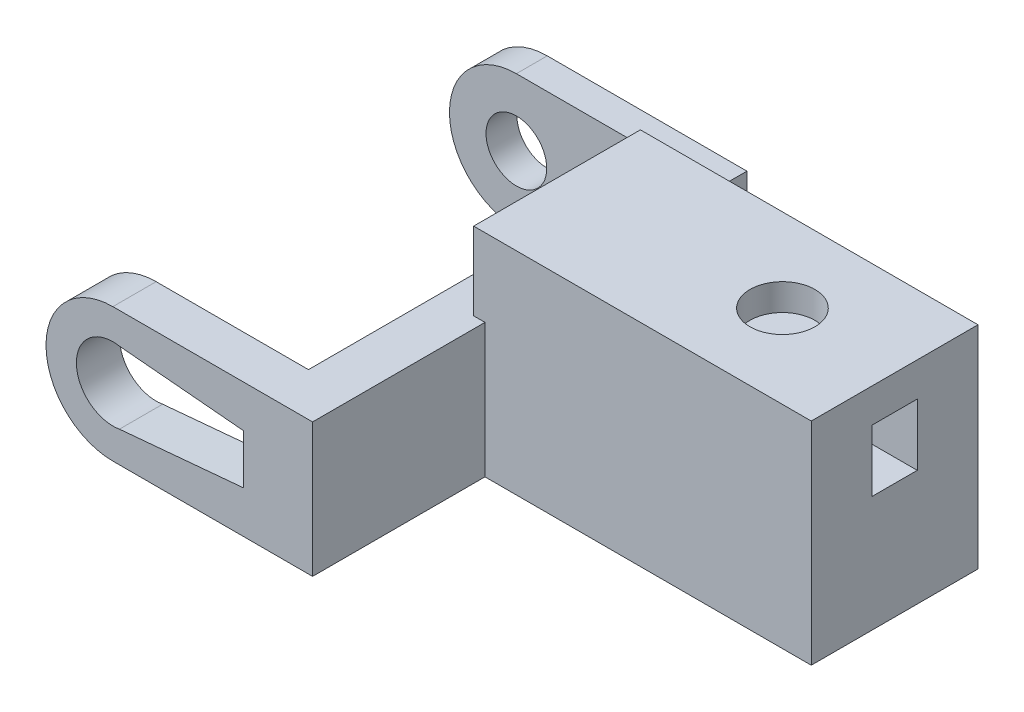
ISO-10303-21;
HEADER;
FILE_DESCRIPTION(('STEP AP214'),'2;1');
FILE_NAME('part.step','',(''),(''),'','','');
FILE_SCHEMA(('AUTOMOTIVE_DESIGN { 1 0 10303 214 1 1 1 1 }'));
ENDSEC;
DATA;
#1=APPLICATION_CONTEXT('core data for automotive mechanical design processes');
#2=APPLICATION_PROTOCOL_DEFINITION('international standard','automotive_design',2000,#1);
#3=PRODUCT_CONTEXT('',#1,'mechanical');
#4=PRODUCT('Part','Part','',(#3));
#5=PRODUCT_RELATED_PRODUCT_CATEGORY('part','',(#4));
#6=PRODUCT_DEFINITION_FORMATION('','',#4);
#7=PRODUCT_DEFINITION_CONTEXT('part definition',#1,'design');
#8=PRODUCT_DEFINITION('design','',#6,#7);
#9=PRODUCT_DEFINITION_SHAPE('','',#8);
#10=(LENGTH_UNIT() NAMED_UNIT(*) SI_UNIT(.MILLI.,.METRE.));
#11=(NAMED_UNIT(*) PLANE_ANGLE_UNIT() SI_UNIT($,.RADIAN.));
#12=(NAMED_UNIT(*) SI_UNIT($,.STERADIAN.) SOLID_ANGLE_UNIT());
#13=UNCERTAINTY_MEASURE_WITH_UNIT(LENGTH_MEASURE(1.E-05),#10,'distance_accuracy_value','');
#14=(GEOMETRIC_REPRESENTATION_CONTEXT(3) GLOBAL_UNCERTAINTY_ASSIGNED_CONTEXT((#13)) GLOBAL_UNIT_ASSIGNED_CONTEXT((#10,
#11,#12)) REPRESENTATION_CONTEXT('',''));
#15=CARTESIAN_POINT('',(0.,0.,0.));
#16=DIRECTION('',(0.,0.,1.));
#17=DIRECTION('',(1.,0.,0.));
#18=AXIS2_PLACEMENT_3D('',#15,#16,#17);
#19=CARTESIAN_POINT('',(-44.6,0.,0.));
#20=DIRECTION('',(-1.,0.,0.));
#21=DIRECTION('',(0.,0.,1.));
#22=AXIS2_PLACEMENT_3D('',#19,#20,#21);
#23=PLANE('',#22);
#24=DIRECTION('',(0.,0.,1.));
#25=VECTOR('',#24,1.);
#26=CARTESIAN_POINT('',(-44.6,-58.,24.85));
#27=LINE('',#26,#25);
#28=CARTESIAN_POINT('',(-44.6,-58.,-14.35));
#29=VERTEX_POINT('',#28);
#30=CARTESIAN_POINT('',(-44.6,-58.,20.65));
#31=VERTEX_POINT('',#30);
#32=EDGE_CURVE('E417',#29,#31,#27,.T.);
#33=ORIENTED_EDGE('',*,*,#32,.F.);
#34=DIRECTION('',(0.,-1.,0.));
#35=VECTOR('',#34,1.);
#36=CARTESIAN_POINT('',(-44.6,0.,-14.35));
#37=LINE('',#36,#35);
#38=CARTESIAN_POINT('',(-44.6,-71.,-14.35));
#39=VERTEX_POINT('',#38);
#40=EDGE_CURVE('E11',#29,#39,#37,.T.);
#41=ORIENTED_EDGE('',*,*,#40,.T.);
#42=DIRECTION('',(0.,0.,-1.));
#43=VECTOR('',#42,1.);
#44=CARTESIAN_POINT('',(-44.6,-71.,24.85));
#45=LINE('',#44,#43);
#46=CARTESIAN_POINT('',(-44.6,-71.,20.65));
#47=VERTEX_POINT('',#46);
#48=EDGE_CURVE('E411',#47,#39,#45,.T.);
#49=ORIENTED_EDGE('',*,*,#48,.F.);
#50=DIRECTION('',(0.,-1.,0.));
#51=VECTOR('',#50,1.);
#52=CARTESIAN_POINT('',(-44.6,0.,20.65));
#53=LINE('',#52,#51);
#54=EDGE_CURVE('E506',#31,#47,#53,.T.);
#55=ORIENTED_EDGE('',*,*,#54,.F.);
#56=EDGE_LOOP('',(#33,#41,#49,#55));
#57=FACE_BOUND('',#56,.T.);
#58=ADVANCED_FACE('F39',(#57),#23,.T.);
#59=CARTESIAN_POINT('',(-41.1,-50.45,8.1));
#60=DIRECTION('',(1.,0.,0.));
#61=DIRECTION('',(0.,0.,-1.));
#62=AXIS2_PLACEMENT_3D('',#59,#60,#61);
#63=PLANE('',#62);
#64=DIRECTION('',(0.,0.,-1.));
#65=VECTOR('',#64,1.);
#66=CARTESIAN_POINT('',(-41.1,-58.,8.1));
#67=LINE('',#66,#65);
#68=CARTESIAN_POINT('',(-41.1,-58.,8.1));
#69=VERTEX_POINT('',#68);
#70=CARTESIAN_POINT('',(-41.1,-58.,-8.1));
#71=VERTEX_POINT('',#70);
#72=EDGE_CURVE('E456',#69,#71,#67,.T.);
#73=ORIENTED_EDGE('',*,*,#72,.F.);
#74=DIRECTION('',(0.,-1.,0.));
#75=VECTOR('',#74,1.);
#76=CARTESIAN_POINT('',(-41.1,-50.45,8.1));
#77=LINE('',#76,#75);
#78=CARTESIAN_POINT('',(-41.1,-50.45,8.1));
#79=VERTEX_POINT('',#78);
#80=EDGE_CURVE('E498',#79,#69,#77,.T.);
#81=ORIENTED_EDGE('',*,*,#80,.F.);
#82=DIRECTION('',(0.,0.,1.));
#83=VECTOR('',#82,1.);
#84=CARTESIAN_POINT('',(-41.1,-50.45,8.1));
#85=LINE('',#84,#83);
#86=CARTESIAN_POINT('',(-41.1,-50.45,-8.1));
#87=VERTEX_POINT('',#86);
#88=EDGE_CURVE('E465',#87,#79,#85,.T.);
#89=ORIENTED_EDGE('',*,*,#88,.F.);
#90=DIRECTION('',(0.,-1.,0.));
#91=VECTOR('',#90,1.);
#92=CARTESIAN_POINT('',(-41.1,-50.45,-8.1));
#93=LINE('',#92,#91);
#94=EDGE_CURVE('E479',#87,#71,#93,.T.);
#95=ORIENTED_EDGE('',*,*,#94,.T.);
#96=EDGE_LOOP('',(#73,#81,#89,#95));
#97=FACE_BOUND('',#96,.T.);
#98=ADVANCED_FACE('F41',(#97),#63,.F.);
#99=CARTESIAN_POINT('',(-41.1,-50.45,8.1));
#100=DIRECTION('',(0.,0.,-1.));
#101=DIRECTION('',(-1.,0.,0.));
#102=AXIS2_PLACEMENT_3D('',#99,#100,#101);
#103=PLANE('',#102);
#104=DIRECTION('',(-1.,0.,0.));
#105=VECTOR('',#104,1.);
#106=CARTESIAN_POINT('',(-41.1,-58.,8.1));
#107=LINE('',#106,#105);
#108=CARTESIAN_POINT('',(-40.,-58.,8.1));
#109=VERTEX_POINT('',#108);
#110=EDGE_CURVE('E460',#109,#69,#107,.T.);
#111=ORIENTED_EDGE('',*,*,#110,.F.);
#112=DIRECTION('',(0.,1.,0.));
#113=VECTOR('',#112,1.);
#114=CARTESIAN_POINT('',(-40.,-50.45,8.1));
#115=LINE('',#114,#113);
#116=CARTESIAN_POINT('',(-40.,-71.,8.1));
#117=VERTEX_POINT('',#116);
#118=EDGE_CURVE('E452',#117,#109,#115,.T.);
#119=ORIENTED_EDGE('',*,*,#118,.F.);
#120=DIRECTION('',(1.,0.,0.));
#121=VECTOR('',#120,1.);
#122=CARTESIAN_POINT('',(-41.1,-71.,8.1));
#123=LINE('',#122,#121);
#124=CARTESIAN_POINT('',(-8.3,-71.,8.1));
#125=VERTEX_POINT('',#124);
#126=EDGE_CURVE('E464',#117,#125,#123,.T.);
#127=ORIENTED_EDGE('',*,*,#126,.T.);
#128=DIRECTION('',(0.,-1.,0.));
#129=VECTOR('',#128,1.);
#130=CARTESIAN_POINT('',(-8.3,-50.45,8.1));
#131=LINE('',#130,#129);
#132=CARTESIAN_POINT('',(-8.3,-50.45,8.1));
#133=VERTEX_POINT('',#132);
#134=EDGE_CURVE('E494',#133,#125,#131,.T.);
#135=ORIENTED_EDGE('',*,*,#134,.F.);
#136=DIRECTION('',(1.,0.,0.));
#137=VECTOR('',#136,1.);
#138=CARTESIAN_POINT('',(-41.1,-50.45,8.1));
#139=LINE('',#138,#137);
#140=EDGE_CURVE('E469',#79,#133,#139,.T.);
#141=ORIENTED_EDGE('',*,*,#140,.F.);
#142=ORIENTED_EDGE('',*,*,#80,.T.);
#143=EDGE_LOOP('',(#111,#119,#127,#135,#141,#142));
#144=FACE_BOUND('',#143,.T.);
#145=ADVANCED_FACE('F555',(#144),#103,.F.);
#146=CARTESIAN_POINT('',(-41.1,-50.45,-8.1));
#147=DIRECTION('',(0.,0.,1.));
#148=DIRECTION('',(1.,0.,0.));
#149=AXIS2_PLACEMENT_3D('',#146,#147,#148);
#150=PLANE('',#149);
#151=DIRECTION('',(1.,0.,0.));
#152=VECTOR('',#151,1.);
#153=CARTESIAN_POINT('',(-41.1,-58.,-8.1));
#154=LINE('',#153,#152);
#155=CARTESIAN_POINT('',(-40.,-58.,-8.1));
#156=VERTEX_POINT('',#155);
#157=EDGE_CURVE('E502',#71,#156,#154,.T.);
#158=ORIENTED_EDGE('',*,*,#157,.F.);
#159=ORIENTED_EDGE('',*,*,#94,.F.);
#160=DIRECTION('',(-1.,0.,0.));
#161=VECTOR('',#160,1.);
#162=CARTESIAN_POINT('',(-41.1,-50.45,-8.1));
#163=LINE('',#162,#161);
#164=CARTESIAN_POINT('',(-8.3,-50.45,-8.1));
#165=VERTEX_POINT('',#164);
#166=EDGE_CURVE('E476',#165,#87,#163,.T.);
#167=ORIENTED_EDGE('',*,*,#166,.F.);
#168=DIRECTION('',(0.,-1.,0.));
#169=VECTOR('',#168,1.);
#170=CARTESIAN_POINT('',(-8.3,-50.45,-8.1));
#171=LINE('',#170,#169);
#172=CARTESIAN_POINT('',(-8.3,-71.,-8.1));
#173=VERTEX_POINT('',#172);
#174=EDGE_CURVE('E490',#165,#173,#171,.T.);
#175=ORIENTED_EDGE('',*,*,#174,.T.);
#176=DIRECTION('',(-1.,0.,0.));
#177=VECTOR('',#176,1.);
#178=CARTESIAN_POINT('',(-41.1,-71.,-8.1));
#179=LINE('',#178,#177);
#180=CARTESIAN_POINT('',(-40.,-71.,-8.1));
#181=VERTEX_POINT('',#180);
#182=EDGE_CURVE('E470',#173,#181,#179,.T.);
#183=ORIENTED_EDGE('',*,*,#182,.T.);
#184=DIRECTION('',(0.,-1.,0.));
#185=VECTOR('',#184,1.);
#186=CARTESIAN_POINT('',(-40.,-50.45,-8.1));
#187=LINE('',#186,#185);
#188=EDGE_CURVE('E448',#156,#181,#187,.T.);
#189=ORIENTED_EDGE('',*,*,#188,.F.);
#190=EDGE_LOOP('',(#158,#159,#167,#175,#183,#189));
#191=FACE_BOUND('',#190,.T.);
#192=ADVANCED_FACE('F582',(#191),#150,.F.);
#193=CARTESIAN_POINT('',(-8.3,-50.45,8.1));
#194=DIRECTION('',(-1.,0.,0.));
#195=DIRECTION('',(0.,0.,1.));
#196=AXIS2_PLACEMENT_3D('',#193,#194,#195);
#197=PLANE('',#196);
#198=DIRECTION('',(0.,0.,-1.));
#199=VECTOR('',#198,1.);
#200=CARTESIAN_POINT('',(-8.3,-59.75,2.2));
#201=LINE('',#200,#199);
#202=CARTESIAN_POINT('',(-8.3,-59.75,2.2));
#203=VERTEX_POINT('',#202);
#204=CARTESIAN_POINT('',(-8.3,-59.75,-2.2));
#205=VERTEX_POINT('',#204);
#206=EDGE_CURVE('E243',#203,#205,#201,.T.);
#207=ORIENTED_EDGE('',*,*,#206,.F.);
#208=DIRECTION('',(0.,-1.,0.));
#209=VECTOR('',#208,1.);
#210=CARTESIAN_POINT('',(-8.3,-59.75,2.2));
#211=LINE('',#210,#209);
#212=CARTESIAN_POINT('',(-8.3,-53.75,2.2));
#213=VERTEX_POINT('',#212);
#214=EDGE_CURVE('E55',#213,#203,#211,.T.);
#215=ORIENTED_EDGE('',*,*,#214,.F.);
#216=DIRECTION('',(0.,0.,1.));
#217=VECTOR('',#216,1.);
#218=CARTESIAN_POINT('',(-8.3,-53.75,2.2));
#219=LINE('',#218,#217);
#220=CARTESIAN_POINT('',(-8.3,-53.75,-2.2));
#221=VERTEX_POINT('',#220);
#222=EDGE_CURVE('E232',#221,#213,#219,.T.);
#223=ORIENTED_EDGE('',*,*,#222,.F.);
#224=DIRECTION('',(0.,1.,0.));
#225=VECTOR('',#224,1.);
#226=CARTESIAN_POINT('',(-8.3,-59.75,-2.2));
#227=LINE('',#226,#225);
#228=EDGE_CURVE('E236',#205,#221,#227,.T.);
#229=ORIENTED_EDGE('',*,*,#228,.F.);
#230=EDGE_LOOP('',(#207,#215,#223,#229));
#231=FACE_BOUND('',#230,.T.);
#232=DIRECTION('',(0.,0.,-1.));
#233=VECTOR('',#232,1.);
#234=CARTESIAN_POINT('',(-8.3,-71.,8.1));
#235=LINE('',#234,#233);
#236=EDGE_CURVE('E482',#125,#173,#235,.T.);
#237=ORIENTED_EDGE('',*,*,#236,.T.);
#238=ORIENTED_EDGE('',*,*,#174,.F.);
#239=DIRECTION('',(0.,0.,-1.));
#240=VECTOR('',#239,1.);
#241=CARTESIAN_POINT('',(-8.3,-50.45,8.1));
#242=LINE('',#241,#240);
#243=EDGE_CURVE('E473',#133,#165,#242,.T.);
#244=ORIENTED_EDGE('',*,*,#243,.F.);
#245=ORIENTED_EDGE('',*,*,#134,.T.);
#246=EDGE_LOOP('',(#237,#238,#244,#245));
#247=FACE_BOUND('',#246,.T.);
#248=ADVANCED_FACE('F577',(#231,#247),#197,.F.);
#249=CARTESIAN_POINT('',(0.,-50.45,0.));
#250=DIRECTION('',(0.,-1.,0.));
#251=DIRECTION('',(0.,0.,-1.));
#252=AXIS2_PLACEMENT_3D('',#249,#250,#251);
#253=PLANE('',#252);
#254=CARTESIAN_POINT('',(-19.2,-50.45,0.));
#255=DIRECTION('',(0.,1.,0.));
#256=DIRECTION('',(0.,0.,1.));
#257=AXIS2_PLACEMENT_3D('',#254,#255,#256);
#258=CIRCLE('',#257,3.15);
#259=CARTESIAN_POINT('',(-19.2,-50.45,3.15));
#260=VERTEX_POINT('',#259);
#261=EDGE_CURVE('E252',#260,#260,#258,.T.);
#262=ORIENTED_EDGE('',*,*,#261,.F.);
#263=EDGE_LOOP('',(#262));
#264=FACE_BOUND('',#263,.T.);
#265=ORIENTED_EDGE('',*,*,#88,.T.);
#266=ORIENTED_EDGE('',*,*,#140,.T.);
#267=ORIENTED_EDGE('',*,*,#243,.T.);
#268=ORIENTED_EDGE('',*,*,#166,.T.);
#269=EDGE_LOOP('',(#265,#266,#267,#268));
#270=FACE_BOUND('',#269,.T.);
#271=ADVANCED_FACE('F574',(#264,#270),#253,.F.);
#272=CARTESIAN_POINT('',(0.,-71.,0.));
#273=DIRECTION('',(0.,-1.,0.));
#274=DIRECTION('',(0.,0.,-1.));
#275=AXIS2_PLACEMENT_3D('',#272,#273,#274);
#276=PLANE('',#275);
#277=CARTESIAN_POINT('',(-10.95,-71.,0.));
#278=DIRECTION('',(0.,1.,0.));
#279=DIRECTION('',(0.,0.,1.));
#280=AXIS2_PLACEMENT_3D('',#277,#278,#279);
#281=CIRCLE('',#280,0.999999999999999);
#282=CARTESIAN_POINT('',(-10.95,-71.,0.999999999999999));
#283=VERTEX_POINT('',#282);
#284=EDGE_CURVE('E266',#283,#283,#281,.T.);
#285=ORIENTED_EDGE('',*,*,#284,.T.);
#286=EDGE_LOOP('',(#285));
#287=FACE_BOUND('',#286,.T.);
#288=CARTESIAN_POINT('',(-38.45,-71.,0.));
#289=DIRECTION('',(0.,1.,0.));
#290=DIRECTION('',(0.,0.,1.));
#291=AXIS2_PLACEMENT_3D('',#288,#289,#290);
#292=CIRCLE('',#291,1.);
#293=CARTESIAN_POINT('',(-38.45,-71.,1.));
#294=VERTEX_POINT('',#293);
#295=EDGE_CURVE('E274',#294,#294,#292,.T.);
#296=ORIENTED_EDGE('',*,*,#295,.T.);
#297=EDGE_LOOP('',(#296));
#298=FACE_BOUND('',#297,.T.);
#299=DIRECTION('',(0.,0.,1.));
#300=VECTOR('',#299,1.);
#301=CARTESIAN_POINT('',(-36.3,-71.,6.5));
#302=LINE('',#301,#300);
#303=CARTESIAN_POINT('',(-36.3,-71.,-6.5));
#304=VERTEX_POINT('',#303);
#305=CARTESIAN_POINT('',(-36.3,-71.,6.5));
#306=VERTEX_POINT('',#305);
#307=EDGE_CURVE('E282',#304,#306,#302,.T.);
#308=ORIENTED_EDGE('',*,*,#307,.T.);
#309=DIRECTION('',(1.,0.,0.));
#310=VECTOR('',#309,1.);
#311=CARTESIAN_POINT('',(-36.3,-71.,6.5));
#312=LINE('',#311,#310);
#313=CARTESIAN_POINT('',(-13.1,-71.,6.5));
#314=VERTEX_POINT('',#313);
#315=EDGE_CURVE('E286',#306,#314,#312,.T.);
#316=ORIENTED_EDGE('',*,*,#315,.T.);
#317=DIRECTION('',(0.,0.,-1.));
#318=VECTOR('',#317,1.);
#319=CARTESIAN_POINT('',(-13.1,-71.,6.5));
#320=LINE('',#319,#318);
#321=CARTESIAN_POINT('',(-13.1,-71.,-6.5));
#322=VERTEX_POINT('',#321);
#323=EDGE_CURVE('E291',#314,#322,#320,.T.);
#324=ORIENTED_EDGE('',*,*,#323,.T.);
#325=DIRECTION('',(-1.,0.,0.));
#326=VECTOR('',#325,1.);
#327=CARTESIAN_POINT('',(-36.3,-71.,-6.5));
#328=LINE('',#327,#326);
#329=EDGE_CURVE('E295',#322,#304,#328,.T.);
#330=ORIENTED_EDGE('',*,*,#329,.T.);
#331=EDGE_LOOP('',(#308,#316,#324,#330));
#332=FACE_BOUND('',#331,.T.);
#333=DIRECTION('',(0.,0.,-1.));
#334=VECTOR('',#333,1.);
#335=CARTESIAN_POINT('',(-59.4,-71.,-14.35));
#336=LINE('',#335,#334);
#337=CARTESIAN_POINT('',(-59.4,-71.,-14.35));
#338=VERTEX_POINT('',#337);
#339=CARTESIAN_POINT('',(-59.4,-71.,-17.35));
#340=VERTEX_POINT('',#339);
#341=EDGE_CURVE('E351',#338,#340,#336,.T.);
#342=ORIENTED_EDGE('',*,*,#341,.T.);
#343=DIRECTION('',(-1.,0.,0.));
#344=VECTOR('',#343,1.);
#345=CARTESIAN_POINT('',(-40.,-71.,-17.35));
#346=LINE('',#345,#344);
#347=CARTESIAN_POINT('',(-40.,-71.,-17.35));
#348=VERTEX_POINT('',#347);
#349=EDGE_CURVE('E441',#348,#340,#346,.T.);
#350=ORIENTED_EDGE('',*,*,#349,.F.);
#351=DIRECTION('',(0.,0.,-1.));
#352=VECTOR('',#351,1.);
#353=CARTESIAN_POINT('',(-40.,-71.,24.85));
#354=LINE('',#353,#352);
#355=EDGE_CURVE('E416',#181,#348,#354,.T.);
#356=ORIENTED_EDGE('',*,*,#355,.F.);
#357=ORIENTED_EDGE('',*,*,#182,.F.);
#358=ORIENTED_EDGE('',*,*,#236,.F.);
#359=ORIENTED_EDGE('',*,*,#126,.F.);
#360=CARTESIAN_POINT('',(-40.,-71.,24.85));
#361=VERTEX_POINT('',#360);
#362=EDGE_CURVE('E418',#361,#117,#354,.T.);
#363=ORIENTED_EDGE('',*,*,#362,.F.);
#364=DIRECTION('',(-1.,0.,0.));
#365=VECTOR('',#364,1.);
#366=CARTESIAN_POINT('',(-40.,-71.,24.85));
#367=LINE('',#366,#365);
#368=CARTESIAN_POINT('',(-59.4,-71.,24.85));
#369=VERTEX_POINT('',#368);
#370=EDGE_CURVE('E445',#361,#369,#367,.T.);
#371=ORIENTED_EDGE('',*,*,#370,.T.);
#372=DIRECTION('',(0.,0.,-1.));
#373=VECTOR('',#372,1.);
#374=CARTESIAN_POINT('',(-59.4,-71.,24.85));
#375=LINE('',#374,#373);
#376=CARTESIAN_POINT('',(-59.4,-71.,20.65));
#377=VERTEX_POINT('',#376);
#378=EDGE_CURVE('E408',#369,#377,#375,.T.);
#379=ORIENTED_EDGE('',*,*,#378,.T.);
#380=DIRECTION('',(1.,0.,0.));
#381=VECTOR('',#380,1.);
#382=CARTESIAN_POINT('',(-59.4,-71.,20.65));
#383=LINE('',#382,#381);
#384=EDGE_CURVE('E394',#377,#47,#383,.T.);
#385=ORIENTED_EDGE('',*,*,#384,.T.);
#386=ORIENTED_EDGE('',*,*,#48,.T.);
#387=DIRECTION('',(1.,0.,0.));
#388=VECTOR('',#387,1.);
#389=CARTESIAN_POINT('',(-59.4,-71.,-14.35));
#390=LINE('',#389,#388);
#391=EDGE_CURVE('E338',#338,#39,#390,.T.);
#392=ORIENTED_EDGE('',*,*,#391,.F.);
#393=EDGE_LOOP('',(#342,#350,#356,#357,#358,#359,#363,#371,#379,#385,#386,#392));
#394=FACE_BOUND('',#393,.T.);
#395=ADVANCED_FACE('F565',(#287,#298,#332,#394),#276,.T.);
#396=CARTESIAN_POINT('',(-40.,-58.,24.85));
#397=DIRECTION('',(0.,-1.,0.));
#398=DIRECTION('',(0.,0.,-1.));
#399=AXIS2_PLACEMENT_3D('',#396,#397,#398);
#400=PLANE('',#399);
#401=DIRECTION('',(-1.,0.,0.));
#402=VECTOR('',#401,1.);
#403=CARTESIAN_POINT('',(-40.,-58.,-17.35));
#404=LINE('',#403,#402);
#405=CARTESIAN_POINT('',(-40.,-58.,-17.35));
#406=VERTEX_POINT('',#405);
#407=CARTESIAN_POINT('',(-59.4,-58.,-17.35));
#408=VERTEX_POINT('',#407);
#409=EDGE_CURVE('E438',#406,#408,#404,.T.);
#410=ORIENTED_EDGE('',*,*,#409,.T.);
#411=DIRECTION('',(0.,0.,-1.));
#412=VECTOR('',#411,1.);
#413=CARTESIAN_POINT('',(-59.4,-58.,-14.35));
#414=LINE('',#413,#412);
#415=CARTESIAN_POINT('',(-59.4,-58.,-14.35));
#416=VERTEX_POINT('',#415);
#417=EDGE_CURVE('E347',#416,#408,#414,.T.);
#418=ORIENTED_EDGE('',*,*,#417,.F.);
#419=DIRECTION('',(-1.,0.,0.));
#420=VECTOR('',#419,1.);
#421=CARTESIAN_POINT('',(-59.4,-58.,-14.35));
#422=LINE('',#421,#420);
#423=EDGE_CURVE('E344',#29,#416,#422,.T.);
#424=ORIENTED_EDGE('',*,*,#423,.F.);
#425=ORIENTED_EDGE('',*,*,#32,.T.);
#426=DIRECTION('',(-1.,0.,0.));
#427=VECTOR('',#426,1.);
#428=CARTESIAN_POINT('',(-59.4,-58.,20.65));
#429=LINE('',#428,#427);
#430=CARTESIAN_POINT('',(-59.4,-58.,20.65));
#431=VERTEX_POINT('',#430);
#432=EDGE_CURVE('E401',#31,#431,#429,.T.);
#433=ORIENTED_EDGE('',*,*,#432,.T.);
#434=DIRECTION('',(0.,0.,-1.));
#435=VECTOR('',#434,1.);
#436=CARTESIAN_POINT('',(-59.4,-58.,24.85));
#437=LINE('',#436,#435);
#438=CARTESIAN_POINT('',(-59.4,-58.,24.85));
#439=VERTEX_POINT('',#438);
#440=EDGE_CURVE('E404',#439,#431,#437,.T.);
#441=ORIENTED_EDGE('',*,*,#440,.F.);
#442=DIRECTION('',(-1.,0.,0.));
#443=VECTOR('',#442,1.);
#444=CARTESIAN_POINT('',(-40.,-58.,24.85));
#445=LINE('',#444,#443);
#446=CARTESIAN_POINT('',(-40.,-58.,24.85));
#447=VERTEX_POINT('',#446);
#448=EDGE_CURVE('E430',#447,#439,#445,.T.);
#449=ORIENTED_EDGE('',*,*,#448,.F.);
#450=DIRECTION('',(0.,0.,1.));
#451=VECTOR('',#450,1.);
#452=CARTESIAN_POINT('',(-40.,-58.,24.85));
#453=LINE('',#452,#451);
#454=EDGE_CURVE('E425',#109,#447,#453,.T.);
#455=ORIENTED_EDGE('',*,*,#454,.F.);
#456=ORIENTED_EDGE('',*,*,#110,.T.);
#457=ORIENTED_EDGE('',*,*,#72,.T.);
#458=ORIENTED_EDGE('',*,*,#157,.T.);
#459=EDGE_CURVE('E426',#406,#156,#453,.T.);
#460=ORIENTED_EDGE('',*,*,#459,.F.);
#461=EDGE_LOOP('',(#410,#418,#424,#425,#433,#441,#449,#455,#456,#457,#458,#460));
#462=FACE_BOUND('',#461,.T.);
#463=ADVANCED_FACE('F562',(#462),#400,.F.);
#464=CARTESIAN_POINT('',(-40.,0.,0.));
#465=DIRECTION('',(-1.,0.,0.));
#466=DIRECTION('',(0.,0.,1.));
#467=AXIS2_PLACEMENT_3D('',#464,#465,#466);
#468=PLANE('',#467);
#469=ORIENTED_EDGE('',*,*,#362,.T.);
#470=ORIENTED_EDGE('',*,*,#118,.T.);
#471=ORIENTED_EDGE('',*,*,#454,.T.);
#472=DIRECTION('',(0.,-1.,0.));
#473=VECTOR('',#472,1.);
#474=CARTESIAN_POINT('',(-40.,-71.,24.85));
#475=LINE('',#474,#473);
#476=EDGE_CURVE('E412',#447,#361,#475,.T.);
#477=ORIENTED_EDGE('',*,*,#476,.T.);
#478=EDGE_LOOP('',(#469,#470,#471,#477));
#479=FACE_BOUND('',#478,.T.);
#480=ADVANCED_FACE('F560',(#479),#468,.F.);
#481=ORIENTED_EDGE('',*,*,#459,.T.);
#482=ORIENTED_EDGE('',*,*,#188,.T.);
#483=ORIENTED_EDGE('',*,*,#355,.T.);
#484=DIRECTION('',(0.,1.,0.));
#485=VECTOR('',#484,1.);
#486=CARTESIAN_POINT('',(-40.,-71.,-17.35));
#487=LINE('',#486,#485);
#488=EDGE_CURVE('E422',#348,#406,#487,.T.);
#489=ORIENTED_EDGE('',*,*,#488,.T.);
#490=EDGE_LOOP('',(#481,#482,#483,#489));
#491=FACE_BOUND('',#490,.T.);
#492=ADVANCED_FACE('F573',(#491),#468,.F.);
#493=CARTESIAN_POINT('',(-40.,-71.,24.85));
#494=DIRECTION('',(0.,0.,-1.));
#495=DIRECTION('',(-1.,0.,0.));
#496=AXIS2_PLACEMENT_3D('',#493,#494,#495);
#497=PLANE('',#496);
#498=CARTESIAN_POINT('',(-59.4,-64.5,24.85));
#499=DIRECTION('',(0.,0.,1.));
#500=DIRECTION('',(1.,0.,0.));
#501=AXIS2_PLACEMENT_3D('',#498,#499,#500);
#502=CIRCLE('',#501,3.55);
#503=CARTESIAN_POINT('',(-58.7641054158039,-61.0074167042445,24.85));
#504=VERTEX_POINT('',#503);
#505=CARTESIAN_POINT('',(-58.7641054158039,-67.9925832957554,24.85));
#506=VERTEX_POINT('',#505);
#507=EDGE_CURVE('E380',#504,#506,#502,.T.);
#508=ORIENTED_EDGE('',*,*,#507,.F.);
#509=DIRECTION('',(-0.995948362239352,0.089926968995698,0.));
#510=VECTOR('',#509,1.);
#511=CARTESIAN_POINT('',(-59.4,-60.95,24.85));
#512=LINE('',#511,#510);
#513=CARTESIAN_POINT('',(-46.7,-62.0967185946041,24.85));
#514=VERTEX_POINT('',#513);
#515=EDGE_CURVE('E360',#514,#504,#512,.T.);
#516=ORIENTED_EDGE('',*,*,#515,.F.);
#517=DIRECTION('',(0.,1.,0.));
#518=VECTOR('',#517,1.);
#519=CARTESIAN_POINT('',(-46.7,-62.0967185946041,24.85));
#520=LINE('',#519,#518);
#521=CARTESIAN_POINT('',(-46.7,-66.9032814053959,24.85));
#522=VERTEX_POINT('',#521);
#523=EDGE_CURVE('E371',#522,#514,#520,.T.);
#524=ORIENTED_EDGE('',*,*,#523,.F.);
#525=DIRECTION('',(0.995948362239352,0.0899269689956986,0.));
#526=VECTOR('',#525,1.);
#527=CARTESIAN_POINT('',(-46.7,-66.9032814053959,24.85));
#528=LINE('',#527,#526);
#529=EDGE_CURVE('E354',#506,#522,#528,.T.);
#530=ORIENTED_EDGE('',*,*,#529,.F.);
#531=EDGE_LOOP('',(#508,#516,#524,#530));
#532=FACE_BOUND('',#531,.T.);
#533=ORIENTED_EDGE('',*,*,#448,.T.);
#534=CARTESIAN_POINT('',(-59.4,-64.5,24.85));
#535=DIRECTION('',(0.,0.,1.));
#536=DIRECTION('',(1.,0.,0.));
#537=AXIS2_PLACEMENT_3D('',#534,#535,#536);
#538=CIRCLE('',#537,6.5);
#539=EDGE_CURVE('E390',#439,#369,#538,.T.);
#540=ORIENTED_EDGE('',*,*,#539,.T.);
#541=ORIENTED_EDGE('',*,*,#370,.F.);
#542=ORIENTED_EDGE('',*,*,#476,.F.);
#543=EDGE_LOOP('',(#533,#540,#541,#542));
#544=FACE_BOUND('',#543,.T.);
#545=ADVANCED_FACE('F525',(#532,#544),#497,.F.);
#546=CARTESIAN_POINT('',(-40.,-71.,-17.35));
#547=DIRECTION('',(0.,0.,1.));
#548=DIRECTION('',(1.,0.,0.));
#549=AXIS2_PLACEMENT_3D('',#546,#547,#548);
#550=PLANE('',#549);
#551=CARTESIAN_POINT('',(-59.4,-64.5,-17.35));
#552=DIRECTION('',(0.,0.,1.));
#553=DIRECTION('',(1.,0.,0.));
#554=AXIS2_PLACEMENT_3D('',#551,#552,#553);
#555=CIRCLE('',#554,2.95);
#556=CARTESIAN_POINT('',(-56.45,-64.5,-17.35));
#557=VERTEX_POINT('',#556);
#558=EDGE_CURVE('E326',#557,#557,#555,.T.);
#559=ORIENTED_EDGE('',*,*,#558,.T.);
#560=EDGE_LOOP('',(#559));
#561=FACE_BOUND('',#560,.T.);
#562=ORIENTED_EDGE('',*,*,#349,.T.);
#563=CARTESIAN_POINT('',(-59.4,-64.5,-17.35));
#564=DIRECTION('',(0.,0.,1.));
#565=DIRECTION('',(1.,0.,0.));
#566=AXIS2_PLACEMENT_3D('',#563,#564,#565);
#567=CIRCLE('',#566,6.5);
#568=EDGE_CURVE('E330',#408,#340,#567,.T.);
#569=ORIENTED_EDGE('',*,*,#568,.F.);
#570=ORIENTED_EDGE('',*,*,#409,.F.);
#571=ORIENTED_EDGE('',*,*,#488,.F.);
#572=EDGE_LOOP('',(#562,#569,#570,#571));
#573=FACE_BOUND('',#572,.T.);
#574=ADVANCED_FACE('F567',(#561,#573),#550,.F.);
#575=CARTESIAN_POINT('',(0.,0.,20.65));
#576=DIRECTION('',(0.,0.,-1.));
#577=DIRECTION('',(-1.,0.,0.));
#578=AXIS2_PLACEMENT_3D('',#575,#576,#577);
#579=PLANE('',#578);
#580=DIRECTION('',(-0.995948362239352,0.089926968995698,0.));
#581=VECTOR('',#580,1.);
#582=CARTESIAN_POINT('',(-59.4,-60.95,20.65));
#583=LINE('',#582,#581);
#584=CARTESIAN_POINT('',(-46.7,-62.0967185946041,20.65));
#585=VERTEX_POINT('',#584);
#586=CARTESIAN_POINT('',(-58.7641054158039,-61.0074167042445,20.65));
#587=VERTEX_POINT('',#586);
#588=EDGE_CURVE('E364',#585,#587,#583,.T.);
#589=ORIENTED_EDGE('',*,*,#588,.T.);
#590=CARTESIAN_POINT('',(-59.4,-64.5,20.65));
#591=DIRECTION('',(0.,0.,1.));
#592=DIRECTION('',(1.,0.,0.));
#593=AXIS2_PLACEMENT_3D('',#590,#591,#592);
#594=CIRCLE('',#593,3.55);
#595=CARTESIAN_POINT('',(-58.7641054158039,-67.9925832957555,20.65));
#596=VERTEX_POINT('',#595);
#597=EDGE_CURVE('E384',#587,#596,#594,.T.);
#598=ORIENTED_EDGE('',*,*,#597,.T.);
#599=DIRECTION('',(0.995948362239352,0.0899269689956986,0.));
#600=VECTOR('',#599,1.);
#601=CARTESIAN_POINT('',(-46.7,-66.9032814053959,20.65));
#602=LINE('',#601,#600);
#603=CARTESIAN_POINT('',(-46.7,-66.9032814053959,20.65));
#604=VERTEX_POINT('',#603);
#605=EDGE_CURVE('E355',#596,#604,#602,.T.);
#606=ORIENTED_EDGE('',*,*,#605,.T.);
#607=DIRECTION('',(0.,1.,0.));
#608=VECTOR('',#607,1.);
#609=CARTESIAN_POINT('',(-46.7,-62.0967185946041,20.65));
#610=LINE('',#609,#608);
#611=EDGE_CURVE('E359',#604,#585,#610,.T.);
#612=ORIENTED_EDGE('',*,*,#611,.T.);
#613=EDGE_LOOP('',(#589,#598,#606,#612));
#614=FACE_BOUND('',#613,.T.);
#615=ORIENTED_EDGE('',*,*,#384,.F.);
#616=CARTESIAN_POINT('',(-59.4,-64.5,20.65));
#617=DIRECTION('',(0.,0.,1.));
#618=DIRECTION('',(1.,0.,0.));
#619=AXIS2_PLACEMENT_3D('',#616,#617,#618);
#620=CIRCLE('',#619,6.5);
#621=EDGE_CURVE('E387',#431,#377,#620,.T.);
#622=ORIENTED_EDGE('',*,*,#621,.F.);
#623=ORIENTED_EDGE('',*,*,#432,.F.);
#624=ORIENTED_EDGE('',*,*,#54,.T.);
#625=EDGE_LOOP('',(#615,#622,#623,#624));
#626=FACE_BOUND('',#625,.T.);
#627=ADVANCED_FACE('F535',(#614,#626),#579,.T.);
#628=CARTESIAN_POINT('',(-59.4,-64.5,24.85));
#629=DIRECTION('',(0.,0.,-1.));
#630=DIRECTION('',(-1.,0.,0.));
#631=AXIS2_PLACEMENT_3D('',#628,#629,#630);
#632=CYLINDRICAL_SURFACE('',#631,6.5);
#633=ORIENTED_EDGE('',*,*,#621,.T.);
#634=ORIENTED_EDGE('',*,*,#378,.F.);
#635=ORIENTED_EDGE('',*,*,#539,.F.);
#636=ORIENTED_EDGE('',*,*,#440,.T.);
#637=EDGE_LOOP('',(#633,#634,#635,#636));
#638=FACE_BOUND('',#637,.T.);
#639=ADVANCED_FACE('F545',(#638),#632,.T.);
#640=CARTESIAN_POINT('',(-59.4,-64.5,20.65));
#641=DIRECTION('',(0.,0.,1.));
#642=DIRECTION('',(1.,0.,0.));
#643=AXIS2_PLACEMENT_3D('',#640,#641,#642);
#644=CYLINDRICAL_SURFACE('',#643,3.55);
#645=ORIENTED_EDGE('',*,*,#507,.T.);
#646=DIRECTION('',(0.,0.,1.));
#647=VECTOR('',#646,1.);
#648=CARTESIAN_POINT('',(-58.7641054158038,-67.9925832957554,20.65));
#649=LINE('',#648,#647);
#650=EDGE_CURVE('E510',#506,#596,#649,.F.);
#651=ORIENTED_EDGE('',*,*,#650,.T.);
#652=ORIENTED_EDGE('',*,*,#597,.F.);
#653=DIRECTION('',(0.,0.,1.));
#654=VECTOR('',#653,1.);
#655=CARTESIAN_POINT('',(-58.7641054158038,-61.0074167042446,20.65));
#656=LINE('',#655,#654);
#657=EDGE_CURVE('E48',#587,#504,#656,.T.);
#658=ORIENTED_EDGE('',*,*,#657,.T.);
#659=EDGE_LOOP('',(#645,#651,#652,#658));
#660=FACE_BOUND('',#659,.T.);
#661=ADVANCED_FACE('F518',(#660),#644,.F.);
#662=CARTESIAN_POINT('',(-59.4,-60.95,20.65));
#663=DIRECTION('',(0.089926968995698,0.995948362239352,0.));
#664=DIRECTION('',(-0.995948362239352,0.089926968995698,0.));
#665=AXIS2_PLACEMENT_3D('',#662,#663,#664);
#666=PLANE('',#665);
#667=ORIENTED_EDGE('',*,*,#588,.F.);
#668=DIRECTION('',(0.,0.,1.));
#669=VECTOR('',#668,1.);
#670=CARTESIAN_POINT('',(-46.7,-62.0967185946041,20.65));
#671=LINE('',#670,#669);
#672=EDGE_CURVE('E377',#585,#514,#671,.T.);
#673=ORIENTED_EDGE('',*,*,#672,.T.);
#674=ORIENTED_EDGE('',*,*,#515,.T.);
#675=ORIENTED_EDGE('',*,*,#657,.F.);
#676=EDGE_LOOP('',(#667,#673,#674,#675));
#677=FACE_BOUND('',#676,.T.);
#678=ADVANCED_FACE('F537',(#677),#666,.F.);
#679=CARTESIAN_POINT('',(-46.7,-66.9032814053959,20.65));
#680=DIRECTION('',(0.0899269689956985,-0.995948362239352,0.));
#681=DIRECTION('',(0.995948362239352,0.0899269689956985,0.));
#682=AXIS2_PLACEMENT_3D('',#679,#680,#681);
#683=PLANE('',#682);
#684=ORIENTED_EDGE('',*,*,#529,.T.);
#685=DIRECTION('',(0.,0.,1.));
#686=VECTOR('',#685,1.);
#687=CARTESIAN_POINT('',(-46.7,-66.9032814053959,20.65));
#688=LINE('',#687,#686);
#689=EDGE_CURVE('E368',#604,#522,#688,.T.);
#690=ORIENTED_EDGE('',*,*,#689,.F.);
#691=ORIENTED_EDGE('',*,*,#605,.F.);
#692=ORIENTED_EDGE('',*,*,#650,.F.);
#693=EDGE_LOOP('',(#684,#690,#691,#692));
#694=FACE_BOUND('',#693,.T.);
#695=ADVANCED_FACE('F529',(#694),#683,.F.);
#696=CARTESIAN_POINT('',(-46.7,-62.0967185946041,20.65));
#697=DIRECTION('',(1.,0.,0.));
#698=DIRECTION('',(0.,0.,-1.));
#699=AXIS2_PLACEMENT_3D('',#696,#697,#698);
#700=PLANE('',#699);
#701=ORIENTED_EDGE('',*,*,#523,.T.);
#702=ORIENTED_EDGE('',*,*,#672,.F.);
#703=ORIENTED_EDGE('',*,*,#611,.F.);
#704=ORIENTED_EDGE('',*,*,#689,.T.);
#705=EDGE_LOOP('',(#701,#702,#703,#704));
#706=FACE_BOUND('',#705,.T.);
#707=ADVANCED_FACE('F533',(#706),#700,.F.);
#708=CARTESIAN_POINT('',(0.,0.,-14.35));
#709=DIRECTION('',(0.,0.,-1.));
#710=DIRECTION('',(-1.,0.,0.));
#711=AXIS2_PLACEMENT_3D('',#708,#709,#710);
#712=PLANE('',#711);
#713=CARTESIAN_POINT('',(-59.4,-64.5,-14.35));
#714=DIRECTION('',(0.,0.,1.));
#715=DIRECTION('',(1.,0.,0.));
#716=AXIS2_PLACEMENT_3D('',#713,#714,#715);
#717=CIRCLE('',#716,2.95);
#718=CARTESIAN_POINT('',(-56.45,-64.5,-14.35));
#719=VERTEX_POINT('',#718);
#720=EDGE_CURVE('E316',#719,#719,#717,.T.);
#721=ORIENTED_EDGE('',*,*,#720,.F.);
#722=EDGE_LOOP('',(#721));
#723=FACE_BOUND('',#722,.T.);
#724=ORIENTED_EDGE('',*,*,#423,.T.);
#725=CARTESIAN_POINT('',(-59.4,-64.5,-14.35));
#726=DIRECTION('',(0.,0.,1.));
#727=DIRECTION('',(1.,0.,0.));
#728=AXIS2_PLACEMENT_3D('',#725,#726,#727);
#729=CIRCLE('',#728,6.5);
#730=EDGE_CURVE('E334',#416,#338,#729,.T.);
#731=ORIENTED_EDGE('',*,*,#730,.T.);
#732=ORIENTED_EDGE('',*,*,#391,.T.);
#733=ORIENTED_EDGE('',*,*,#40,.F.);
#734=EDGE_LOOP('',(#724,#731,#732,#733));
#735=FACE_BOUND('',#734,.T.);
#736=ADVANCED_FACE('F639',(#723,#735),#712,.F.);
#737=CARTESIAN_POINT('',(-59.4,-64.5,-14.35));
#738=DIRECTION('',(0.,0.,-1.));
#739=DIRECTION('',(-1.,0.,0.));
#740=AXIS2_PLACEMENT_3D('',#737,#738,#739);
#741=CYLINDRICAL_SURFACE('',#740,6.5);
#742=ORIENTED_EDGE('',*,*,#568,.T.);
#743=ORIENTED_EDGE('',*,*,#341,.F.);
#744=ORIENTED_EDGE('',*,*,#730,.F.);
#745=ORIENTED_EDGE('',*,*,#417,.T.);
#746=EDGE_LOOP('',(#742,#743,#744,#745));
#747=FACE_BOUND('',#746,.T.);
#748=ADVANCED_FACE('F636',(#747),#741,.T.);
#749=CARTESIAN_POINT('',(-59.4,-64.5,-17.35));
#750=DIRECTION('',(0.,0.,1.));
#751=DIRECTION('',(1.,0.,0.));
#752=AXIS2_PLACEMENT_3D('',#749,#750,#751);
#753=CYLINDRICAL_SURFACE('',#752,2.95);
#754=ORIENTED_EDGE('',*,*,#558,.F.);
#755=EDGE_LOOP('',(#754));
#756=FACE_BOUND('',#755,.T.);
#757=ORIENTED_EDGE('',*,*,#720,.T.);
#758=EDGE_LOOP('',(#757));
#759=FACE_BOUND('',#758,.T.);
#760=ADVANCED_FACE('F633',(#756,#759),#753,.F.);
#761=CARTESIAN_POINT('',(-36.3,-71.,6.5));
#762=DIRECTION('',(-1.,0.,0.));
#763=DIRECTION('',(0.,0.,1.));
#764=AXIS2_PLACEMENT_3D('',#761,#762,#763);
#765=PLANE('',#764);
#766=DIRECTION('',(0.,0.,1.));
#767=VECTOR('',#766,1.);
#768=CARTESIAN_POINT('',(-36.3,-53.75,6.5));
#769=LINE('',#768,#767);
#770=CARTESIAN_POINT('',(-36.3,-53.75,-6.5));
#771=VERTEX_POINT('',#770);
#772=CARTESIAN_POINT('',(-36.3,-53.75,6.5));
#773=VERTEX_POINT('',#772);
#774=EDGE_CURVE('E278',#771,#773,#769,.T.);
#775=ORIENTED_EDGE('',*,*,#774,.T.);
#776=DIRECTION('',(0.,1.,0.));
#777=VECTOR('',#776,1.);
#778=CARTESIAN_POINT('',(-36.3,-71.,6.5));
#779=LINE('',#778,#777);
#780=EDGE_CURVE('E299',#306,#773,#779,.T.);
#781=ORIENTED_EDGE('',*,*,#780,.F.);
#782=ORIENTED_EDGE('',*,*,#307,.F.);
#783=DIRECTION('',(0.,1.,0.));
#784=VECTOR('',#783,1.);
#785=CARTESIAN_POINT('',(-36.3,-71.,-6.5));
#786=LINE('',#785,#784);
#787=EDGE_CURVE('E313',#304,#771,#786,.T.);
#788=ORIENTED_EDGE('',*,*,#787,.T.);
#789=EDGE_LOOP('',(#775,#781,#782,#788));
#790=FACE_BOUND('',#789,.T.);
#791=ADVANCED_FACE('F612',(#790),#765,.F.);
#792=CARTESIAN_POINT('',(-36.3,-71.,-6.5));
#793=DIRECTION('',(0.,0.,-1.));
#794=DIRECTION('',(-1.,0.,0.));
#795=AXIS2_PLACEMENT_3D('',#792,#793,#794);
#796=PLANE('',#795);
#797=DIRECTION('',(-1.,0.,0.));
#798=VECTOR('',#797,1.);
#799=CARTESIAN_POINT('',(-36.3,-53.75,-6.5));
#800=LINE('',#799,#798);
#801=CARTESIAN_POINT('',(-13.1,-53.75,-6.5));
#802=VERTEX_POINT('',#801);
#803=EDGE_CURVE('E287',#802,#771,#800,.T.);
#804=ORIENTED_EDGE('',*,*,#803,.T.);
#805=ORIENTED_EDGE('',*,*,#787,.F.);
#806=ORIENTED_EDGE('',*,*,#329,.F.);
#807=DIRECTION('',(0.,1.,0.));
#808=VECTOR('',#807,1.);
#809=CARTESIAN_POINT('',(-13.1,-71.,-6.5));
#810=LINE('',#809,#808);
#811=EDGE_CURVE('E317',#322,#802,#810,.T.);
#812=ORIENTED_EDGE('',*,*,#811,.T.);
#813=EDGE_LOOP('',(#804,#805,#806,#812));
#814=FACE_BOUND('',#813,.T.);
#815=ADVANCED_FACE('F607',(#814),#796,.F.);
#816=CARTESIAN_POINT('',(-13.1,-71.,6.5));
#817=DIRECTION('',(1.,0.,0.));
#818=DIRECTION('',(0.,0.,-1.));
#819=AXIS2_PLACEMENT_3D('',#816,#817,#818);
#820=PLANE('',#819);
#821=DIRECTION('',(0.,0.,-1.));
#822=VECTOR('',#821,1.);
#823=CARTESIAN_POINT('',(-13.1,-53.75,6.5));
#824=LINE('',#823,#822);
#825=CARTESIAN_POINT('',(-13.1,-53.75,6.5));
#826=VERTEX_POINT('',#825);
#827=CARTESIAN_POINT('',(-13.1,-53.75,2.2));
#828=VERTEX_POINT('',#827);
#829=EDGE_CURVE('E230',#826,#828,#824,.T.);
#830=ORIENTED_EDGE('',*,*,#829,.T.);
#831=DIRECTION('',(0.,-1.,0.));
#832=VECTOR('',#831,1.);
#833=CARTESIAN_POINT('',(-13.1,-59.75,2.2));
#834=LINE('',#833,#832);
#835=CARTESIAN_POINT('',(-13.1,-59.75,2.2));
#836=VERTEX_POINT('',#835);
#837=EDGE_CURVE('E60',#828,#836,#834,.T.);
#838=ORIENTED_EDGE('',*,*,#837,.T.);
#839=DIRECTION('',(0.,0.,-1.));
#840=VECTOR('',#839,1.);
#841=CARTESIAN_POINT('',(-13.1,-59.75,2.2));
#842=LINE('',#841,#840);
#843=CARTESIAN_POINT('',(-13.1,-59.75,-2.2));
#844=VERTEX_POINT('',#843);
#845=EDGE_CURVE('E220',#836,#844,#842,.T.);
#846=ORIENTED_EDGE('',*,*,#845,.T.);
#847=DIRECTION('',(0.,1.,0.));
#848=VECTOR('',#847,1.);
#849=CARTESIAN_POINT('',(-13.1,-59.75,-2.2));
#850=LINE('',#849,#848);
#851=CARTESIAN_POINT('',(-13.1,-53.75,-2.2));
#852=VERTEX_POINT('',#851);
#853=EDGE_CURVE('E217',#844,#852,#850,.T.);
#854=ORIENTED_EDGE('',*,*,#853,.T.);
#855=EDGE_CURVE('E307',#852,#802,#824,.T.);
#856=ORIENTED_EDGE('',*,*,#855,.T.);
#857=ORIENTED_EDGE('',*,*,#811,.F.);
#858=ORIENTED_EDGE('',*,*,#323,.F.);
#859=DIRECTION('',(0.,1.,0.));
#860=VECTOR('',#859,1.);
#861=CARTESIAN_POINT('',(-13.1,-71.,6.5));
#862=LINE('',#861,#860);
#863=EDGE_CURVE('E321',#314,#826,#862,.T.);
#864=ORIENTED_EDGE('',*,*,#863,.T.);
#865=EDGE_LOOP('',(#830,#838,#846,#854,#856,#857,#858,#864));
#866=FACE_BOUND('',#865,.T.);
#867=ADVANCED_FACE('F228',(#866),#820,.F.);
#868=CARTESIAN_POINT('',(-36.3,-71.,6.5));
#869=DIRECTION('',(0.,0.,1.));
#870=DIRECTION('',(1.,0.,0.));
#871=AXIS2_PLACEMENT_3D('',#868,#869,#870);
#872=PLANE('',#871);
#873=DIRECTION('',(1.,0.,0.));
#874=VECTOR('',#873,1.);
#875=CARTESIAN_POINT('',(-36.3,-53.75,6.5));
#876=LINE('',#875,#874);
#877=EDGE_CURVE('E303',#773,#826,#876,.T.);
#878=ORIENTED_EDGE('',*,*,#877,.T.);
#879=ORIENTED_EDGE('',*,*,#863,.F.);
#880=ORIENTED_EDGE('',*,*,#315,.F.);
#881=ORIENTED_EDGE('',*,*,#780,.T.);
#882=EDGE_LOOP('',(#878,#879,#880,#881));
#883=FACE_BOUND('',#882,.T.);
#884=ADVANCED_FACE('F619',(#883),#872,.F.);
#885=CARTESIAN_POINT('',(0.,-53.75,0.));
#886=DIRECTION('',(0.,-1.,0.));
#887=DIRECTION('',(0.,0.,-1.));
#888=AXIS2_PLACEMENT_3D('',#885,#886,#887);
#889=PLANE('',#888);
#890=ORIENTED_EDGE('',*,*,#774,.F.);
#891=ORIENTED_EDGE('',*,*,#803,.F.);
#892=ORIENTED_EDGE('',*,*,#855,.F.);
#893=DIRECTION('',(1.,0.,0.));
#894=VECTOR('',#893,1.);
#895=CARTESIAN_POINT('',(-13.1,-53.75,-2.2));
#896=LINE('',#895,#894);
#897=EDGE_CURVE('E253',#852,#221,#896,.T.);
#898=ORIENTED_EDGE('',*,*,#897,.T.);
#899=ORIENTED_EDGE('',*,*,#222,.T.);
#900=DIRECTION('',(1.,0.,0.));
#901=VECTOR('',#900,1.);
#902=CARTESIAN_POINT('',(-13.1,-53.75,2.2));
#903=LINE('',#902,#901);
#904=EDGE_CURVE('E249',#828,#213,#903,.T.);
#905=ORIENTED_EDGE('',*,*,#904,.F.);
#906=ORIENTED_EDGE('',*,*,#829,.F.);
#907=ORIENTED_EDGE('',*,*,#877,.F.);
#908=EDGE_LOOP('',(#890,#891,#892,#898,#899,#905,#906,#907));
#909=FACE_BOUND('',#908,.T.);
#910=ADVANCED_FACE('F609',(#909),#889,.T.);
#911=CARTESIAN_POINT('',(-38.45,-71.,0.));
#912=DIRECTION('',(0.,1.,0.));
#913=DIRECTION('',(0.,0.,1.));
#914=AXIS2_PLACEMENT_3D('',#911,#912,#913);
#915=CYLINDRICAL_SURFACE('',#914,1.);
#916=ORIENTED_EDGE('',*,*,#295,.F.);
#917=EDGE_LOOP('',(#916));
#918=FACE_BOUND('',#917,.T.);
#919=CARTESIAN_POINT('',(-38.45,-65.,0.));
#920=DIRECTION('',(0.,1.,0.));
#921=DIRECTION('',(0.,0.,1.));
#922=AXIS2_PLACEMENT_3D('',#919,#920,#921);
#923=CIRCLE('',#922,1.);
#924=CARTESIAN_POINT('',(-38.45,-65.,1.));
#925=VERTEX_POINT('',#924);
#926=EDGE_CURVE('E270',#925,#925,#923,.T.);
#927=ORIENTED_EDGE('',*,*,#926,.T.);
#928=EDGE_LOOP('',(#927));
#929=FACE_BOUND('',#928,.T.);
#930=ADVANCED_FACE('F626',(#918,#929),#915,.F.);
#931=CARTESIAN_POINT('',(-38.45,-65.,0.));
#932=DIRECTION('',(0.,1.,0.));
#933=DIRECTION('',(0.,0.,1.));
#934=AXIS2_PLACEMENT_3D('',#931,#932,#933);
#935=PLANE('',#934);
#936=ORIENTED_EDGE('',*,*,#926,.F.);
#937=EDGE_LOOP('',(#936));
#938=FACE_BOUND('',#937,.T.);
#939=ADVANCED_FACE('F772',(#938),#935,.F.);
#940=CARTESIAN_POINT('',(-10.95,-71.,0.));
#941=DIRECTION('',(0.,1.,0.));
#942=DIRECTION('',(0.,0.,1.));
#943=AXIS2_PLACEMENT_3D('',#940,#941,#942);
#944=CYLINDRICAL_SURFACE('',#943,0.999999999999999);
#945=ORIENTED_EDGE('',*,*,#284,.F.);
#946=EDGE_LOOP('',(#945));
#947=FACE_BOUND('',#946,.T.);
#948=CARTESIAN_POINT('',(-10.95,-65.,0.));
#949=DIRECTION('',(0.,1.,0.));
#950=DIRECTION('',(0.,0.,1.));
#951=AXIS2_PLACEMENT_3D('',#948,#949,#950);
#952=CIRCLE('',#951,0.999999999999999);
#953=CARTESIAN_POINT('',(-10.95,-65.,0.999999999999999));
#954=VERTEX_POINT('',#953);
#955=EDGE_CURVE('E262',#954,#954,#952,.T.);
#956=ORIENTED_EDGE('',*,*,#955,.T.);
#957=EDGE_LOOP('',(#956));
#958=FACE_BOUND('',#957,.T.);
#959=ADVANCED_FACE('F782',(#947,#958),#944,.F.);
#960=CARTESIAN_POINT('',(-10.95,-65.,0.));
#961=DIRECTION('',(0.,1.,0.));
#962=DIRECTION('',(0.,0.,1.));
#963=AXIS2_PLACEMENT_3D('',#960,#961,#962);
#964=PLANE('',#963);
#965=ORIENTED_EDGE('',*,*,#955,.F.);
#966=EDGE_LOOP('',(#965));
#967=FACE_BOUND('',#966,.T.);
#968=ADVANCED_FACE('F798',(#967),#964,.F.);
#969=CARTESIAN_POINT('',(-19.2,-53.05,0.));
#970=DIRECTION('',(0.,1.,0.));
#971=DIRECTION('',(0.,0.,1.));
#972=AXIS2_PLACEMENT_3D('',#969,#970,#971);
#973=CYLINDRICAL_SURFACE('',#972,3.15);
#974=CARTESIAN_POINT('',(-19.2,-53.05,0.));
#975=DIRECTION('',(0.,1.,0.));
#976=DIRECTION('',(0.,0.,1.));
#977=AXIS2_PLACEMENT_3D('',#974,#975,#976);
#978=CIRCLE('',#977,3.15);
#979=CARTESIAN_POINT('',(-19.2,-53.05,3.15));
#980=VERTEX_POINT('',#979);
#981=EDGE_CURVE('E258',#980,#980,#978,.T.);
#982=ORIENTED_EDGE('',*,*,#981,.F.);
#983=EDGE_LOOP('',(#982));
#984=FACE_BOUND('',#983,.T.);
#985=ORIENTED_EDGE('',*,*,#261,.T.);
#986=EDGE_LOOP('',(#985));
#987=FACE_BOUND('',#986,.T.);
#988=ADVANCED_FACE('F808',(#984,#987),#973,.F.);
#989=CARTESIAN_POINT('',(-19.2,-53.05,0.));
#990=DIRECTION('',(0.,1.,0.));
#991=DIRECTION('',(0.,0.,1.));
#992=AXIS2_PLACEMENT_3D('',#989,#990,#991);
#993=PLANE('',#992);
#994=ORIENTED_EDGE('',*,*,#981,.T.);
#995=EDGE_LOOP('',(#994));
#996=FACE_BOUND('',#995,.T.);
#997=ADVANCED_FACE('F826',(#996),#993,.T.);
#998=CARTESIAN_POINT('',(-13.1,-59.75,2.2));
#999=DIRECTION('',(0.,0.,1.));
#1000=DIRECTION('',(1.,0.,0.));
#1001=AXIS2_PLACEMENT_3D('',#998,#999,#1000);
#1002=PLANE('',#1001);
#1003=ORIENTED_EDGE('',*,*,#214,.T.);
#1004=DIRECTION('',(1.,0.,0.));
#1005=VECTOR('',#1004,1.);
#1006=CARTESIAN_POINT('',(-13.1,-59.75,2.2));
#1007=LINE('',#1006,#1005);
#1008=EDGE_CURVE('E209',#836,#203,#1007,.T.);
#1009=ORIENTED_EDGE('',*,*,#1008,.F.);
#1010=ORIENTED_EDGE('',*,*,#837,.F.);
#1011=ORIENTED_EDGE('',*,*,#904,.T.);
#1012=EDGE_LOOP('',(#1003,#1009,#1010,#1011));
#1013=FACE_BOUND('',#1012,.T.);
#1014=ADVANCED_FACE('F211',(#1013),#1002,.F.);
#1015=CARTESIAN_POINT('',(-13.1,-59.75,-2.2));
#1016=DIRECTION('',(0.,0.,-1.));
#1017=DIRECTION('',(-1.,0.,0.));
#1018=AXIS2_PLACEMENT_3D('',#1015,#1016,#1017);
#1019=PLANE('',#1018);
#1020=ORIENTED_EDGE('',*,*,#228,.T.);
#1021=ORIENTED_EDGE('',*,*,#897,.F.);
#1022=ORIENTED_EDGE('',*,*,#853,.F.);
#1023=DIRECTION('',(1.,0.,0.));
#1024=VECTOR('',#1023,1.);
#1025=CARTESIAN_POINT('',(-13.1,-59.75,-2.2));
#1026=LINE('',#1025,#1024);
#1027=EDGE_CURVE('E216',#844,#205,#1026,.T.);
#1028=ORIENTED_EDGE('',*,*,#1027,.T.);
#1029=EDGE_LOOP('',(#1020,#1021,#1022,#1028));
#1030=FACE_BOUND('',#1029,.T.);
#1031=ADVANCED_FACE('F861',(#1030),#1019,.F.);
#1032=CARTESIAN_POINT('',(-13.1,-59.75,2.2));
#1033=DIRECTION('',(0.,-1.,0.));
#1034=DIRECTION('',(0.,0.,-1.));
#1035=AXIS2_PLACEMENT_3D('',#1032,#1033,#1034);
#1036=PLANE('',#1035);
#1037=ORIENTED_EDGE('',*,*,#206,.T.);
#1038=ORIENTED_EDGE('',*,*,#1027,.F.);
#1039=ORIENTED_EDGE('',*,*,#845,.F.);
#1040=ORIENTED_EDGE('',*,*,#1008,.T.);
#1041=EDGE_LOOP('',(#1037,#1038,#1039,#1040));
#1042=FACE_BOUND('',#1041,.T.);
#1043=ADVANCED_FACE('F221',(#1042),#1036,.F.);
#1044=CLOSED_SHELL('',(#58,#98,#145,#192,#248,#271,#395,#463,#480,#492,#545,#574,#627,#639,#661,
#678,#695,#707,#736,#748,#760,#791,#815,#867,#884,#910,#930,#939,#959,#968,#988,#997,#1014,
#1031,#1043));
#1045=MANIFOLD_SOLID_BREP('B2',#1044);
#1046=ADVANCED_BREP_SHAPE_REPRESENTATION('',(#18,#1045),#14);
#1047=SHAPE_DEFINITION_REPRESENTATION(#9,#1046);
ENDSEC;
END-ISO-10303-21;
